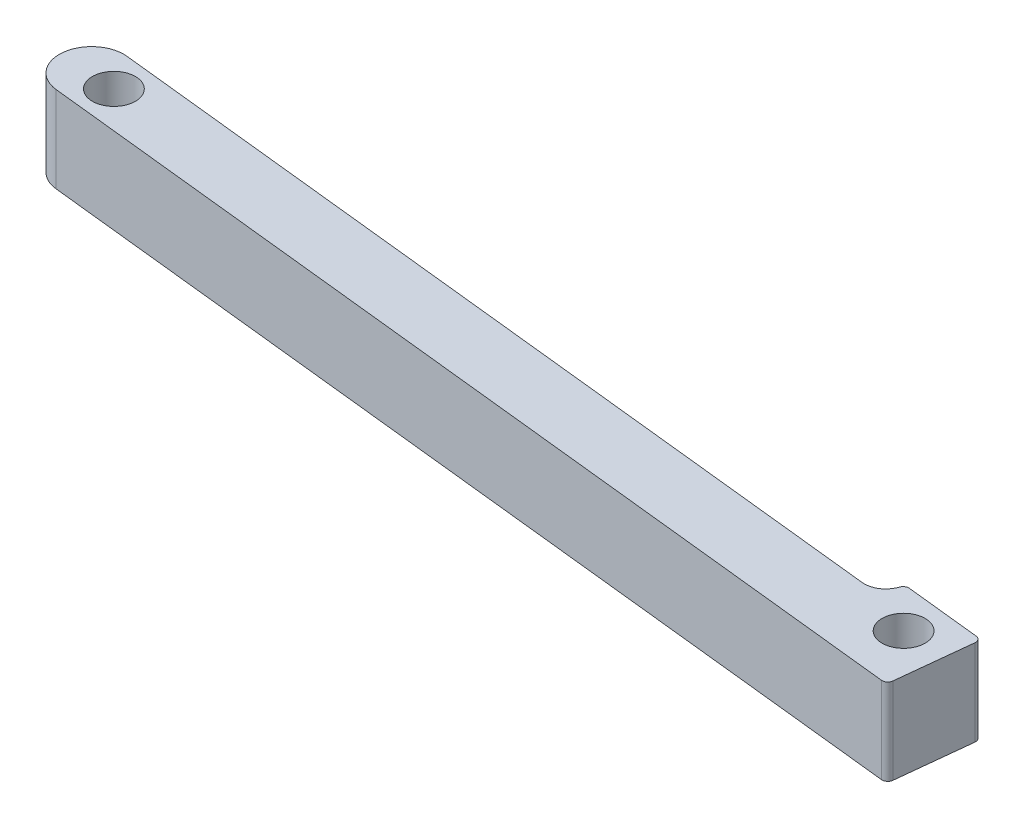
ISO-10303-21;
HEADER;
FILE_DESCRIPTION(('STEP AP214'),'2;1');
FILE_NAME('part.step','',(''),(''),'','','');
FILE_SCHEMA(('AUTOMOTIVE_DESIGN { 1 0 10303 214 1 1 1 1 }'));
ENDSEC;
DATA;
#1=APPLICATION_CONTEXT('core data for automotive mechanical design processes');
#2=APPLICATION_PROTOCOL_DEFINITION('international standard','automotive_design',2000,#1);
#3=PRODUCT_CONTEXT('',#1,'mechanical');
#4=PRODUCT('Part','Part','',(#3));
#5=PRODUCT_RELATED_PRODUCT_CATEGORY('part','',(#4));
#6=PRODUCT_DEFINITION_FORMATION('','',#4);
#7=PRODUCT_DEFINITION_CONTEXT('part definition',#1,'design');
#8=PRODUCT_DEFINITION('design','',#6,#7);
#9=PRODUCT_DEFINITION_SHAPE('','',#8);
#10=(LENGTH_UNIT() NAMED_UNIT(*) SI_UNIT(.MILLI.,.METRE.));
#11=(NAMED_UNIT(*) PLANE_ANGLE_UNIT() SI_UNIT($,.RADIAN.));
#12=(NAMED_UNIT(*) SI_UNIT($,.STERADIAN.) SOLID_ANGLE_UNIT());
#13=UNCERTAINTY_MEASURE_WITH_UNIT(LENGTH_MEASURE(1.E-05),#10,'distance_accuracy_value','');
#14=(GEOMETRIC_REPRESENTATION_CONTEXT(3) GLOBAL_UNCERTAINTY_ASSIGNED_CONTEXT((#13)) GLOBAL_UNIT_ASSIGNED_CONTEXT((#10,
#11,#12)) REPRESENTATION_CONTEXT('',''));
#15=CARTESIAN_POINT('',(0.,0.,0.));
#16=DIRECTION('',(0.,0.,1.));
#17=DIRECTION('',(1.,0.,0.));
#18=AXIS2_PLACEMENT_3D('',#15,#16,#17);
#19=CARTESIAN_POINT('',(161.42092567785,19.05,66.642458073349));
#20=DIRECTION('',(0.106429967465671,0.,-0.994320200954027));
#21=DIRECTION('',(-0.994320200954027,0.,-0.106429967465671));
#22=AXIS2_PLACEMENT_3D('',#19,#20,#21);
#23=PLANE('',#22);
#24=DIRECTION('',(0.994320200954027,0.,0.106429967465671));
#25=VECTOR('',#24,1.);
#26=CARTESIAN_POINT('',(161.42092567785,0.,66.642458073349));
#27=LINE('',#26,#25);
#28=CARTESIAN_POINT('',(-44.3999120852,0.,44.6118234288342));
#29=VERTEX_POINT('',#28);
#30=CARTESIAN_POINT('',(160.158139022639,0.,66.5072920146676));
#31=VERTEX_POINT('',#30);
#32=EDGE_CURVE('E190',#29,#31,#27,.T.);
#33=ORIENTED_EDGE('',*,*,#32,.T.);
#34=DIRECTION('',(0.,-1.,0.));
#35=VECTOR('',#34,1.);
#36=CARTESIAN_POINT('',(160.158139022639,19.05,66.5072920146676));
#37=LINE('',#36,#35);
#38=CARTESIAN_POINT('',(160.158139022639,19.05,66.5072920146676));
#39=VERTEX_POINT('',#38);
#40=EDGE_CURVE('E164',#31,#39,#37,.F.);
#41=ORIENTED_EDGE('',*,*,#40,.T.);
#42=DIRECTION('',(0.994320200954027,0.,0.106429967465671));
#43=VECTOR('',#42,1.);
#44=CARTESIAN_POINT('',(161.42092567785,19.05,66.642458073349));
#45=LINE('',#44,#43);
#46=CARTESIAN_POINT('',(-44.3999120852,19.05,44.6118234288342));
#47=VERTEX_POINT('',#46);
#48=EDGE_CURVE('E187',#47,#39,#45,.T.);
#49=ORIENTED_EDGE('',*,*,#48,.F.);
#50=DIRECTION('',(0.,-1.,0.));
#51=VECTOR('',#50,1.);
#52=CARTESIAN_POINT('',(-44.3999120852,19.05,44.6118234288342));
#53=LINE('',#52,#51);
#54=EDGE_CURVE('E139',#47,#29,#53,.T.);
#55=ORIENTED_EDGE('',*,*,#54,.T.);
#56=EDGE_LOOP('',(#33,#41,#49,#55));
#57=FACE_BOUND('',#56,.T.);
#58=ADVANCED_FACE('F33',(#57),#23,.F.);
#59=CARTESIAN_POINT('',(163.448416558071,19.05,47.7006582451747));
#60=DIRECTION('',(-0.994320200954026,0.,-0.106429967465674));
#61=DIRECTION('',(-0.106429967465674,0.,0.994320200954027));
#62=AXIS2_PLACEMENT_3D('',#59,#60,#61);
#63=PLANE('',#62);
#64=DIRECTION('',(0.106429967465674,0.,-0.994320200954027));
#65=VECTOR('',#64,1.);
#66=CARTESIAN_POINT('',(163.448416558071,19.05,47.7006582451747));
#67=LINE('',#66,#65);
#68=CARTESIAN_POINT('',(161.556091736532,19.05,65.3796714181374));
#69=VERTEX_POINT('',#68);
#70=CARTESIAN_POINT('',(163.31325049939,19.05,48.9634449003863));
#71=VERTEX_POINT('',#70);
#72=EDGE_CURVE('E132',#69,#71,#67,.T.);
#73=ORIENTED_EDGE('',*,*,#72,.F.);
#74=DIRECTION('',(0.,-1.,0.));
#75=VECTOR('',#74,1.);
#76=CARTESIAN_POINT('',(161.556091736532,19.05,65.3796714181374));
#77=LINE('',#76,#75);
#78=CARTESIAN_POINT('',(161.556091736532,0.,65.3796714181374));
#79=VERTEX_POINT('',#78);
#80=EDGE_CURVE('E155',#69,#79,#77,.T.);
#81=ORIENTED_EDGE('',*,*,#80,.T.);
#82=DIRECTION('',(0.106429967465674,0.,-0.994320200954027));
#83=VECTOR('',#82,1.);
#84=CARTESIAN_POINT('',(163.448416558071,0.,47.7006582451747));
#85=LINE('',#84,#83);
#86=CARTESIAN_POINT('',(163.31325049939,0.,48.9634449003863));
#87=VERTEX_POINT('',#86);
#88=EDGE_CURVE('E188',#79,#87,#85,.T.);
#89=ORIENTED_EDGE('',*,*,#88,.T.);
#90=DIRECTION('',(0.,-1.,0.));
#91=VECTOR('',#90,1.);
#92=CARTESIAN_POINT('',(163.31325049939,19.05,48.9634449003863));
#93=LINE('',#92,#91);
#94=EDGE_CURVE('E151',#87,#71,#93,.F.);
#95=ORIENTED_EDGE('',*,*,#94,.T.);
#96=EDGE_LOOP('',(#73,#81,#89,#95));
#97=FACE_BOUND('',#96,.T.);
#98=ADVANCED_FACE('F227',(#97),#63,.F.);
#99=CARTESIAN_POINT('',(-49.4755961405443,19.05,24.9097145205771));
#100=DIRECTION('',(-0.106429967465671,0.,0.994320200954027));
#101=DIRECTION('',(0.994320200954027,0.,0.106429967465671));
#102=AXIS2_PLACEMENT_3D('',#99,#100,#101);
#103=PLANE('',#102);
#104=DIRECTION('',(-0.994320200954027,0.,-0.106429967465671));
#105=VECTOR('',#104,1.);
#106=CARTESIAN_POINT('',(-49.4755961405443,19.05,24.9097145205771));
#107=LINE('',#106,#105);
#108=CARTESIAN_POINT('',(162.18562990286,19.05,47.5654921864933));
#109=VERTEX_POINT('',#108);
#110=CARTESIAN_POINT('',(145.634972049295,19.05,45.7939441728854));
#111=VERTEX_POINT('',#110);
#112=EDGE_CURVE('E130',#109,#111,#107,.T.);
#113=ORIENTED_EDGE('',*,*,#112,.F.);
#114=DIRECTION('',(0.,-1.,0.));
#115=VECTOR('',#114,1.);
#116=CARTESIAN_POINT('',(162.18562990286,19.05,47.5654921864933));
#117=LINE('',#116,#115);
#118=CARTESIAN_POINT('',(162.18562990286,0.,47.5654921864933));
#119=VERTEX_POINT('',#118);
#120=EDGE_CURVE('E41',#109,#119,#117,.T.);
#121=ORIENTED_EDGE('',*,*,#120,.T.);
#122=DIRECTION('',(-0.994320200954027,0.,-0.106429967465671));
#123=VECTOR('',#122,1.);
#124=CARTESIAN_POINT('',(-49.4755961405443,0.,24.9097145205771));
#125=LINE('',#124,#123);
#126=CARTESIAN_POINT('',(145.634972049295,0.,45.7939441728854));
#127=VERTEX_POINT('',#126);
#128=EDGE_CURVE('E135',#119,#127,#125,.T.);
#129=ORIENTED_EDGE('',*,*,#128,.T.);
#130=DIRECTION('',(0.,-1.,0.));
#131=VECTOR('',#130,1.);
#132=CARTESIAN_POINT('',(145.634972049295,19.05,45.7939441728854));
#133=LINE('',#132,#131);
#134=EDGE_CURVE('E171',#127,#111,#133,.F.);
#135=ORIENTED_EDGE('',*,*,#134,.T.);
#136=EDGE_LOOP('',(#113,#121,#129,#135));
#137=FACE_BOUND('',#136,.T.);
#138=ADVANCED_FACE('F178',(#137),#103,.F.);
#139=CARTESIAN_POINT('',(0.,19.05,0.));
#140=DIRECTION('',(0.,-1.,0.));
#141=DIRECTION('',(0.,0.,-1.));
#142=AXIS2_PLACEMENT_3D('',#139,#140,#141);
#143=PLANE('',#142);
#144=CARTESIAN_POINT('',(153.132728777225,19.05,54.5793294001368));
#145=DIRECTION('',(0.,1.,0.));
#146=DIRECTION('',(0.,0.,1.));
#147=AXIS2_PLACEMENT_3D('',#144,#145,#146);
#148=CIRCLE('',#147,4.76250000000001);
#149=CARTESIAN_POINT('',(153.132728777225,19.05,59.3418294001368));
#150=VERTEX_POINT('',#149);
#151=EDGE_CURVE('E205',#150,#150,#148,.T.);
#152=ORIENTED_EDGE('',*,*,#151,.F.);
#153=EDGE_LOOP('',(#152));
#154=FACE_BOUND('',#153,.T.);
#155=CARTESIAN_POINT('',(-38.1149113885663,19.05,38.1));
#156=DIRECTION('',(0.,1.,0.));
#157=DIRECTION('',(0.,0.,1.));
#158=AXIS2_PLACEMENT_3D('',#155,#156,#157);
#159=CIRCLE('',#158,4.7625);
#160=CARTESIAN_POINT('',(-38.1149113885663,19.05,42.8625));
#161=VERTEX_POINT('',#160);
#162=EDGE_CURVE('E199',#161,#161,#159,.T.);
#163=ORIENTED_EDGE('',*,*,#162,.F.);
#164=EDGE_LOOP('',(#163));
#165=FACE_BOUND('',#164,.T.);
#166=ORIENTED_EDGE('',*,*,#48,.T.);
#167=CARTESIAN_POINT('',(160.29330508132,19.05,65.244505359456));
#168=DIRECTION('',(0.,-1.,0.));
#169=DIRECTION('',(0.,0.,-1.));
#170=AXIS2_PLACEMENT_3D('',#167,#168,#169);
#171=CIRCLE('',#170,1.27);
#172=EDGE_CURVE('E169',#39,#69,#171,.F.);
#173=ORIENTED_EDGE('',*,*,#172,.T.);
#174=ORIENTED_EDGE('',*,*,#72,.T.);
#175=CARTESIAN_POINT('',(162.050463844178,19.05,48.8282788417049));
#176=DIRECTION('',(0.,-1.,0.));
#177=DIRECTION('',(0.,0.,-1.));
#178=AXIS2_PLACEMENT_3D('',#175,#176,#177);
#179=CIRCLE('',#178,1.27);
#180=EDGE_CURVE('E167',#71,#109,#179,.F.);
#181=ORIENTED_EDGE('',*,*,#180,.T.);
#182=ORIENTED_EDGE('',*,*,#112,.T.);
#183=CARTESIAN_POINT('',(145.499805990613,19.05,47.056730828097));
#184=DIRECTION('',(0.,-1.,0.));
#185=DIRECTION('',(0.,0.,-1.));
#186=AXIS2_PLACEMENT_3D('',#183,#184,#185);
#187=CIRCLE('',#186,1.27);
#188=CARTESIAN_POINT('',(144.293776681611,19.05,46.6587442632132));
#189=VERTEX_POINT('',#188);
#190=EDGE_CURVE('E48',#111,#189,#187,.F.);
#191=ORIENTED_EDGE('',*,*,#190,.T.);
#192=CARTESIAN_POINT('',(139.771166772854,19.05,45.1662946448988));
#193=DIRECTION('',(0.,-1.,0.));
#194=DIRECTION('',(0.,0.,-1.));
#195=AXIS2_PLACEMENT_3D('',#192,#193,#194);
#196=CIRCLE('',#195,4.7625);
#197=CARTESIAN_POINT('',(139.264294052798,19.05,49.9017446019424));
#198=VERTEX_POINT('',#197);
#199=EDGE_CURVE('E107',#189,#198,#196,.T.);
#200=ORIENTED_EDGE('',*,*,#199,.T.);
#201=DIRECTION('',(0.994320200954026,0.,0.106429967465673));
#202=VECTOR('',#201,1.);
#203=CARTESIAN_POINT('',(-49.9824688605996,19.05,29.6451644776207));
#204=LINE('',#203,#202);
#205=CARTESIAN_POINT('',(-42.8792939250342,19.05,30.4054735577036));
#206=VERTEX_POINT('',#205);
#207=EDGE_CURVE('E111',#206,#198,#204,.T.);
#208=ORIENTED_EDGE('',*,*,#207,.F.);
#209=CARTESIAN_POINT('',(-43.6396030051171,19.05,37.5086484932689));
#210=DIRECTION('',(0.,-1.,0.));
#211=DIRECTION('',(0.,0.,-1.));
#212=AXIS2_PLACEMENT_3D('',#209,#210,#211);
#213=CIRCLE('',#212,7.14375);
#214=CARTESIAN_POINT('',(-50.7427779406824,19.05,36.748339413186));
#215=VERTEX_POINT('',#214);
#216=EDGE_CURVE('E146',#206,#215,#213,.F.);
#217=ORIENTED_EDGE('',*,*,#216,.T.);
#218=CARTESIAN_POINT('',(-43.6396030051171,19.05,37.5086484932689));
#219=DIRECTION('',(0.,-1.,0.));
#220=DIRECTION('',(0.,0.,-1.));
#221=AXIS2_PLACEMENT_3D('',#218,#219,#220);
#222=CIRCLE('',#221,7.14375);
#223=EDGE_CURVE('E148',#215,#47,#222,.F.);
#224=ORIENTED_EDGE('',*,*,#223,.T.);
#225=EDGE_LOOP('',(#166,#173,#174,#181,#182,#191,#200,#208,#217,#224));
#226=FACE_BOUND('',#225,.T.);
#227=ADVANCED_FACE('F110',(#154,#165,#226),#143,.F.);
#228=CARTESIAN_POINT('',(0.,0.,0.));
#229=DIRECTION('',(0.,-1.,0.));
#230=DIRECTION('',(0.,0.,-1.));
#231=AXIS2_PLACEMENT_3D('',#228,#229,#230);
#232=PLANE('',#231);
#233=ORIENTED_EDGE('',*,*,#88,.F.);
#234=CARTESIAN_POINT('',(160.29330508132,0.,65.244505359456));
#235=DIRECTION('',(0.,-1.,0.));
#236=DIRECTION('',(0.,0.,-1.));
#237=AXIS2_PLACEMENT_3D('',#234,#235,#236);
#238=CIRCLE('',#237,1.27);
#239=EDGE_CURVE('E162',#79,#31,#238,.T.);
#240=ORIENTED_EDGE('',*,*,#239,.T.);
#241=ORIENTED_EDGE('',*,*,#32,.F.);
#242=CARTESIAN_POINT('',(-43.6396030051171,0.,37.5086484932689));
#243=DIRECTION('',(0.,-1.,0.));
#244=DIRECTION('',(0.,0.,-1.));
#245=AXIS2_PLACEMENT_3D('',#242,#243,#244);
#246=CIRCLE('',#245,7.14375);
#247=CARTESIAN_POINT('',(-50.7427779406824,0.,36.748339413186));
#248=VERTEX_POINT('',#247);
#249=EDGE_CURVE('E144',#29,#248,#246,.T.);
#250=ORIENTED_EDGE('',*,*,#249,.T.);
#251=CARTESIAN_POINT('',(-43.6396030051171,0.,37.5086484932689));
#252=DIRECTION('',(0.,-1.,0.));
#253=DIRECTION('',(0.,0.,-1.));
#254=AXIS2_PLACEMENT_3D('',#251,#252,#253);
#255=CIRCLE('',#254,7.14375);
#256=CARTESIAN_POINT('',(-42.8792939250342,0.,30.4054735577036));
#257=VERTEX_POINT('',#256);
#258=EDGE_CURVE('E142',#248,#257,#255,.T.);
#259=ORIENTED_EDGE('',*,*,#258,.T.);
#260=DIRECTION('',(0.994320200954026,0.,0.106429967465673));
#261=VECTOR('',#260,1.);
#262=CARTESIAN_POINT('',(-49.9824688605996,0.,29.6451644776207));
#263=LINE('',#262,#261);
#264=CARTESIAN_POINT('',(139.264294052798,0.,49.9017446019424));
#265=VERTEX_POINT('',#264);
#266=EDGE_CURVE('E125',#257,#265,#263,.T.);
#267=ORIENTED_EDGE('',*,*,#266,.T.);
#268=CARTESIAN_POINT('',(139.771166772854,0.,45.1662946448988));
#269=DIRECTION('',(0.,-1.,0.));
#270=DIRECTION('',(0.,0.,-1.));
#271=AXIS2_PLACEMENT_3D('',#268,#269,#270);
#272=CIRCLE('',#271,4.7625);
#273=CARTESIAN_POINT('',(144.293776681611,0.,46.6587442632132));
#274=VERTEX_POINT('',#273);
#275=EDGE_CURVE('E115',#265,#274,#272,.F.);
#276=ORIENTED_EDGE('',*,*,#275,.T.);
#277=CARTESIAN_POINT('',(145.499805990613,0.,47.056730828097));
#278=DIRECTION('',(0.,-1.,0.));
#279=DIRECTION('',(0.,0.,-1.));
#280=AXIS2_PLACEMENT_3D('',#277,#278,#279);
#281=CIRCLE('',#280,1.27);
#282=EDGE_CURVE('E158',#274,#127,#281,.T.);
#283=ORIENTED_EDGE('',*,*,#282,.T.);
#284=ORIENTED_EDGE('',*,*,#128,.F.);
#285=CARTESIAN_POINT('',(162.050463844178,0.,48.8282788417049));
#286=DIRECTION('',(0.,-1.,0.));
#287=DIRECTION('',(0.,0.,-1.));
#288=AXIS2_PLACEMENT_3D('',#285,#286,#287);
#289=CIRCLE('',#288,1.27);
#290=EDGE_CURVE('E160',#119,#87,#289,.T.);
#291=ORIENTED_EDGE('',*,*,#290,.T.);
#292=EDGE_LOOP('',(#233,#240,#241,#250,#259,#267,#276,#283,#284,#291));
#293=FACE_BOUND('',#292,.T.);
#294=CARTESIAN_POINT('',(153.132728777225,0.,54.5793294001368));
#295=DIRECTION('',(0.,1.,0.));
#296=DIRECTION('',(0.,0.,1.));
#297=AXIS2_PLACEMENT_3D('',#294,#295,#296);
#298=CIRCLE('',#297,4.76250000000001);
#299=CARTESIAN_POINT('',(153.132728777225,0.,59.3418294001368));
#300=VERTEX_POINT('',#299);
#301=EDGE_CURVE('E202',#300,#300,#298,.T.);
#302=ORIENTED_EDGE('',*,*,#301,.T.);
#303=EDGE_LOOP('',(#302));
#304=FACE_BOUND('',#303,.T.);
#305=CARTESIAN_POINT('',(-38.1149113885663,0.,38.1));
#306=DIRECTION('',(0.,1.,0.));
#307=DIRECTION('',(0.,0.,1.));
#308=AXIS2_PLACEMENT_3D('',#305,#306,#307);
#309=CIRCLE('',#308,4.7625);
#310=CARTESIAN_POINT('',(-38.1149113885663,0.,42.8625));
#311=VERTEX_POINT('',#310);
#312=EDGE_CURVE('E194',#311,#311,#309,.T.);
#313=ORIENTED_EDGE('',*,*,#312,.T.);
#314=EDGE_LOOP('',(#313));
#315=FACE_BOUND('',#314,.T.);
#316=ADVANCED_FACE('F183',(#293,#304,#315),#232,.T.);
#317=CARTESIAN_POINT('',(-38.1149113885663,0.,38.1));
#318=DIRECTION('',(0.,1.,0.));
#319=DIRECTION('',(0.,0.,1.));
#320=AXIS2_PLACEMENT_3D('',#317,#318,#319);
#321=CYLINDRICAL_SURFACE('',#320,4.7625);
#322=CARTESIAN_POINT('',(-38.1149113885663,0.,42.8625));
#323=CARTESIAN_POINT('',(-38.1149113885663,0.1984375,42.8625));
#324=CARTESIAN_POINT('',(-38.1149113885663,0.396875,42.8625));
#325=CARTESIAN_POINT('',(-38.1149113885663,0.79375,42.8625));
#326=CARTESIAN_POINT('',(-38.1149113885663,0.9921875,42.8625));
#327=CARTESIAN_POINT('',(-38.1149113885663,1.3890625,42.8625));
#328=CARTESIAN_POINT('',(-38.1149113885663,1.5875,42.8625));
#329=CARTESIAN_POINT('',(-38.1149113885663,1.984375,42.8625));
#330=CARTESIAN_POINT('',(-38.1149113885663,2.1828125,42.8625));
#331=CARTESIAN_POINT('',(-38.1149113885663,2.5796875,42.8625));
#332=CARTESIAN_POINT('',(-38.1149113885663,2.778125,42.8625));
#333=CARTESIAN_POINT('',(-38.1149113885663,3.175,42.8625));
#334=CARTESIAN_POINT('',(-38.1149113885663,3.3734375,42.8625));
#335=CARTESIAN_POINT('',(-38.1149113885663,3.7703125,42.8625));
#336=CARTESIAN_POINT('',(-38.1149113885663,3.96875,42.8625));
#337=CARTESIAN_POINT('',(-38.1149113885663,4.365625,42.8625));
#338=CARTESIAN_POINT('',(-38.1149113885663,4.5640625,42.8625));
#339=CARTESIAN_POINT('',(-38.1149113885663,4.9609375,42.8625));
#340=CARTESIAN_POINT('',(-38.1149113885663,5.159375,42.8625));
#341=CARTESIAN_POINT('',(-38.1149113885663,5.55625,42.8625));
#342=CARTESIAN_POINT('',(-38.1149113885663,5.7546875,42.8625));
#343=CARTESIAN_POINT('',(-38.1149113885663,6.1515625,42.8625));
#344=CARTESIAN_POINT('',(-38.1149113885663,6.35,42.8625));
#345=CARTESIAN_POINT('',(-38.1149113885663,6.746875,42.8625));
#346=CARTESIAN_POINT('',(-38.1149113885663,6.9453125,42.8625));
#347=CARTESIAN_POINT('',(-38.1149113885663,7.3421875,42.8625));
#348=CARTESIAN_POINT('',(-38.1149113885663,7.540625,42.8625));
#349=CARTESIAN_POINT('',(-38.1149113885663,7.9375,42.8625));
#350=CARTESIAN_POINT('',(-38.1149113885663,8.1359375,42.8625));
#351=CARTESIAN_POINT('',(-38.1149113885663,8.5328125,42.8625));
#352=CARTESIAN_POINT('',(-38.1149113885663,8.73125,42.8625));
#353=CARTESIAN_POINT('',(-38.1149113885663,9.128125,42.8625));
#354=CARTESIAN_POINT('',(-38.1149113885663,9.3265625,42.8625));
#355=CARTESIAN_POINT('',(-38.1149113885663,9.7234375,42.8625));
#356=CARTESIAN_POINT('',(-38.1149113885663,9.921875,42.8625));
#357=CARTESIAN_POINT('',(-38.1149113885663,10.31875,42.8625));
#358=CARTESIAN_POINT('',(-38.1149113885663,10.5171875,42.8625));
#359=CARTESIAN_POINT('',(-38.1149113885663,10.9140625,42.8625));
#360=CARTESIAN_POINT('',(-38.1149113885663,11.1125,42.8625));
#361=CARTESIAN_POINT('',(-38.1149113885663,11.509375,42.8625));
#362=CARTESIAN_POINT('',(-38.1149113885663,11.7078125,42.8625));
#363=CARTESIAN_POINT('',(-38.1149113885663,12.1046875,42.8625));
#364=CARTESIAN_POINT('',(-38.1149113885663,12.303125,42.8625));
#365=CARTESIAN_POINT('',(-38.1149113885663,12.7,42.8625));
#366=CARTESIAN_POINT('',(-38.1149113885663,12.8984375,42.8625));
#367=CARTESIAN_POINT('',(-38.1149113885663,13.2953125,42.8625));
#368=CARTESIAN_POINT('',(-38.1149113885663,13.49375,42.8625));
#369=CARTESIAN_POINT('',(-38.1149113885663,13.890625,42.8625));
#370=CARTESIAN_POINT('',(-38.1149113885663,14.0890625,42.8625));
#371=CARTESIAN_POINT('',(-38.1149113885663,14.4859375,42.8625));
#372=CARTESIAN_POINT('',(-38.1149113885663,14.684375,42.8625));
#373=CARTESIAN_POINT('',(-38.1149113885663,15.08125,42.8625));
#374=CARTESIAN_POINT('',(-38.1149113885663,15.2796875,42.8625));
#375=CARTESIAN_POINT('',(-38.1149113885663,15.6765625,42.8625));
#376=CARTESIAN_POINT('',(-38.1149113885663,15.875,42.8625));
#377=CARTESIAN_POINT('',(-38.1149113885663,16.271875,42.8625));
#378=CARTESIAN_POINT('',(-38.1149113885663,16.4703125,42.8625));
#379=CARTESIAN_POINT('',(-38.1149113885663,16.8671875,42.8625));
#380=CARTESIAN_POINT('',(-38.1149113885663,17.065625,42.8625));
#381=CARTESIAN_POINT('',(-38.1149113885663,17.4625,42.8625));
#382=CARTESIAN_POINT('',(-38.1149113885663,17.6609375,42.8625));
#383=CARTESIAN_POINT('',(-38.1149113885663,18.0578125,42.8625));
#384=CARTESIAN_POINT('',(-38.1149113885663,18.25625,42.8625));
#385=CARTESIAN_POINT('',(-38.1149113885663,18.653125,42.8625));
#386=CARTESIAN_POINT('',(-38.1149113885663,18.8515625,42.8625));
#387=CARTESIAN_POINT('',(-38.1149113885663,19.05,42.8625));
#388=B_SPLINE_CURVE_WITH_KNOTS('',3,(#322,#323,#324,#325,#326,#327,#328,#329,#330,#331,#332,
#333,#334,#335,#336,#337,#338,#339,#340,#341,#342,#343,#344,#345,#346,#347,#348,#349,#350,#351,
#352,#353,#354,#355,#356,#357,#358,#359,#360,#361,#362,#363,#364,#365,#366,#367,#368,#369,#370,
#371,#372,#373,#374,#375,#376,#377,#378,#379,#380,#381,#382,#383,#384,#385,#386,#387),
.UNSPECIFIED.,.F.,.F.,(4,2,2,2,2,2,2,2,2,2,2,2,2,2,2,2,2,2,2,2,2,2,2,2,2,2,2,2,2,2,2,2,4),(0.,
0.5953125,1.190625,1.7859375,2.38125,2.9765625,3.571875,4.1671875,4.7625,5.3578125,5.953125,
6.5484375,7.14375,7.7390625,8.334375,8.9296875,9.525,10.1203125,10.715625,11.3109375,11.90625,
12.5015625,13.096875,13.6921875,14.2875,14.8828125,15.478125,16.0734375,16.66875,17.2640625,
17.859375,18.4546875,19.05),.UNSPECIFIED.);
#389=EDGE_CURVE('BSEAM286',#311,#161,#388,.T.);
#390=ORIENTED_EDGE('',*,*,#312,.F.);
#391=ORIENTED_EDGE('',*,*,#162,.T.);
#392=ORIENTED_EDGE('',*,*,#389,.T.);
#393=ORIENTED_EDGE('',*,*,#389,.F.);
#394=EDGE_LOOP('',(#390,#392,#391,#393));
#395=FACE_BOUND('',#394,.T.);
#396=ADVANCED_FACE('F286',(#395),#321,.F.);
#397=CARTESIAN_POINT('',(153.132728777225,0.,54.5793294001368));
#398=DIRECTION('',(0.,1.,0.));
#399=DIRECTION('',(0.,0.,1.));
#400=AXIS2_PLACEMENT_3D('',#397,#398,#399);
#401=CYLINDRICAL_SURFACE('',#400,4.76250000000001);
#402=CARTESIAN_POINT('',(153.132728777225,0.,59.3418294001368));
#403=CARTESIAN_POINT('',(153.132728777225,0.1984375,59.3418294001368));
#404=CARTESIAN_POINT('',(153.132728777225,0.396875,59.3418294001368));
#405=CARTESIAN_POINT('',(153.132728777225,0.79375,59.3418294001368));
#406=CARTESIAN_POINT('',(153.132728777225,0.9921875,59.3418294001368));
#407=CARTESIAN_POINT('',(153.132728777225,1.3890625,59.3418294001368));
#408=CARTESIAN_POINT('',(153.132728777225,1.5875,59.3418294001368));
#409=CARTESIAN_POINT('',(153.132728777225,1.984375,59.3418294001368));
#410=CARTESIAN_POINT('',(153.132728777225,2.1828125,59.3418294001368));
#411=CARTESIAN_POINT('',(153.132728777225,2.5796875,59.3418294001368));
#412=CARTESIAN_POINT('',(153.132728777225,2.778125,59.3418294001368));
#413=CARTESIAN_POINT('',(153.132728777225,3.175,59.3418294001368));
#414=CARTESIAN_POINT('',(153.132728777225,3.3734375,59.3418294001368));
#415=CARTESIAN_POINT('',(153.132728777225,3.7703125,59.3418294001368));
#416=CARTESIAN_POINT('',(153.132728777225,3.96875,59.3418294001368));
#417=CARTESIAN_POINT('',(153.132728777225,4.365625,59.3418294001368));
#418=CARTESIAN_POINT('',(153.132728777225,4.5640625,59.3418294001368));
#419=CARTESIAN_POINT('',(153.132728777225,4.9609375,59.3418294001368));
#420=CARTESIAN_POINT('',(153.132728777225,5.159375,59.3418294001368));
#421=CARTESIAN_POINT('',(153.132728777225,5.55625,59.3418294001368));
#422=CARTESIAN_POINT('',(153.132728777225,5.7546875,59.3418294001368));
#423=CARTESIAN_POINT('',(153.132728777225,6.1515625,59.3418294001368));
#424=CARTESIAN_POINT('',(153.132728777225,6.35,59.3418294001368));
#425=CARTESIAN_POINT('',(153.132728777225,6.746875,59.3418294001368));
#426=CARTESIAN_POINT('',(153.132728777225,6.9453125,59.3418294001368));
#427=CARTESIAN_POINT('',(153.132728777225,7.3421875,59.3418294001368));
#428=CARTESIAN_POINT('',(153.132728777225,7.540625,59.3418294001368));
#429=CARTESIAN_POINT('',(153.132728777225,7.9375,59.3418294001368));
#430=CARTESIAN_POINT('',(153.132728777225,8.1359375,59.3418294001368));
#431=CARTESIAN_POINT('',(153.132728777225,8.5328125,59.3418294001368));
#432=CARTESIAN_POINT('',(153.132728777225,8.73125,59.3418294001368));
#433=CARTESIAN_POINT('',(153.132728777225,9.128125,59.3418294001368));
#434=CARTESIAN_POINT('',(153.132728777225,9.3265625,59.3418294001368));
#435=CARTESIAN_POINT('',(153.132728777225,9.7234375,59.3418294001368));
#436=CARTESIAN_POINT('',(153.132728777225,9.921875,59.3418294001368));
#437=CARTESIAN_POINT('',(153.132728777225,10.31875,59.3418294001368));
#438=CARTESIAN_POINT('',(153.132728777225,10.5171875,59.3418294001368));
#439=CARTESIAN_POINT('',(153.132728777225,10.9140625,59.3418294001368));
#440=CARTESIAN_POINT('',(153.132728777225,11.1125,59.3418294001368));
#441=CARTESIAN_POINT('',(153.132728777225,11.509375,59.3418294001368));
#442=CARTESIAN_POINT('',(153.132728777225,11.7078125,59.3418294001368));
#443=CARTESIAN_POINT('',(153.132728777225,12.1046875,59.3418294001368));
#444=CARTESIAN_POINT('',(153.132728777225,12.303125,59.3418294001368));
#445=CARTESIAN_POINT('',(153.132728777225,12.7,59.3418294001368));
#446=CARTESIAN_POINT('',(153.132728777225,12.8984375,59.3418294001368));
#447=CARTESIAN_POINT('',(153.132728777225,13.2953125,59.3418294001368));
#448=CARTESIAN_POINT('',(153.132728777225,13.49375,59.3418294001368));
#449=CARTESIAN_POINT('',(153.132728777225,13.890625,59.3418294001368));
#450=CARTESIAN_POINT('',(153.132728777225,14.0890625,59.3418294001368));
#451=CARTESIAN_POINT('',(153.132728777225,14.4859375,59.3418294001368));
#452=CARTESIAN_POINT('',(153.132728777225,14.684375,59.3418294001368));
#453=CARTESIAN_POINT('',(153.132728777225,15.08125,59.3418294001368));
#454=CARTESIAN_POINT('',(153.132728777225,15.2796875,59.3418294001368));
#455=CARTESIAN_POINT('',(153.132728777225,15.6765625,59.3418294001368));
#456=CARTESIAN_POINT('',(153.132728777225,15.875,59.3418294001368));
#457=CARTESIAN_POINT('',(153.132728777225,16.271875,59.3418294001368));
#458=CARTESIAN_POINT('',(153.132728777225,16.4703125,59.3418294001368));
#459=CARTESIAN_POINT('',(153.132728777225,16.8671875,59.3418294001368));
#460=CARTESIAN_POINT('',(153.132728777225,17.065625,59.3418294001368));
#461=CARTESIAN_POINT('',(153.132728777225,17.4625,59.3418294001368));
#462=CARTESIAN_POINT('',(153.132728777225,17.6609375,59.3418294001368));
#463=CARTESIAN_POINT('',(153.132728777225,18.0578125,59.3418294001368));
#464=CARTESIAN_POINT('',(153.132728777225,18.25625,59.3418294001368));
#465=CARTESIAN_POINT('',(153.132728777225,18.653125,59.3418294001368));
#466=CARTESIAN_POINT('',(153.132728777225,18.8515625,59.3418294001368));
#467=CARTESIAN_POINT('',(153.132728777225,19.05,59.3418294001368));
#468=B_SPLINE_CURVE_WITH_KNOTS('',3,(#402,#403,#404,#405,#406,#407,#408,#409,#410,#411,#412,
#413,#414,#415,#416,#417,#418,#419,#420,#421,#422,#423,#424,#425,#426,#427,#428,#429,#430,#431,
#432,#433,#434,#435,#436,#437,#438,#439,#440,#441,#442,#443,#444,#445,#446,#447,#448,#449,#450,
#451,#452,#453,#454,#455,#456,#457,#458,#459,#460,#461,#462,#463,#464,#465,#466,#467),
.UNSPECIFIED.,.F.,.F.,(4,2,2,2,2,2,2,2,2,2,2,2,2,2,2,2,2,2,2,2,2,2,2,2,2,2,2,2,2,2,2,2,4),(0.,
0.5953125,1.190625,1.7859375,2.38125,2.9765625,3.571875,4.1671875,4.7625,5.3578125,5.953125,
6.5484375,7.14375,7.7390625,8.334375,8.9296875,9.525,10.1203125,10.715625,11.3109375,11.90625,
12.5015625,13.096875,13.6921875,14.2875,14.8828125,15.478125,16.0734375,16.66875,17.2640625,
17.859375,18.4546875,19.05),.UNSPECIFIED.);
#469=EDGE_CURVE('BSEAM320',#300,#150,#468,.T.);
#470=ORIENTED_EDGE('',*,*,#301,.F.);
#471=ORIENTED_EDGE('',*,*,#151,.T.);
#472=ORIENTED_EDGE('',*,*,#469,.T.);
#473=ORIENTED_EDGE('',*,*,#469,.F.);
#474=EDGE_LOOP('',(#470,#472,#471,#473));
#475=FACE_BOUND('',#474,.T.);
#476=ADVANCED_FACE('F320',(#475),#401,.F.);
#477=CARTESIAN_POINT('',(-49.9824688605996,0.,29.6451644776207));
#478=DIRECTION('',(-0.106429967465673,0.,0.994320200954027));
#479=DIRECTION('',(0.994320200954027,0.,0.106429967465673));
#480=AXIS2_PLACEMENT_3D('',#477,#478,#479);
#481=PLANE('',#480);
#482=ORIENTED_EDGE('',*,*,#266,.F.);
#483=DIRECTION('',(0.,1.,0.));
#484=VECTOR('',#483,1.);
#485=CARTESIAN_POINT('',(-42.8792939250342,0.,30.4054735577036));
#486=LINE('',#485,#484);
#487=EDGE_CURVE('E124',#257,#206,#486,.T.);
#488=ORIENTED_EDGE('',*,*,#487,.T.);
#489=ORIENTED_EDGE('',*,*,#207,.T.);
#490=DIRECTION('',(0.,1.,0.));
#491=VECTOR('',#490,1.);
#492=CARTESIAN_POINT('',(139.264294052798,0.,49.9017446019424));
#493=LINE('',#492,#491);
#494=EDGE_CURVE('E116',#198,#265,#493,.F.);
#495=ORIENTED_EDGE('',*,*,#494,.T.);
#496=EDGE_LOOP('',(#482,#488,#489,#495));
#497=FACE_BOUND('',#496,.T.);
#498=ADVANCED_FACE('F121',(#497),#481,.F.);
#499=CARTESIAN_POINT('',(139.771166772854,0.,45.1662946448988));
#500=DIRECTION('',(0.,-1.,0.));
#501=DIRECTION('',(0.,0.,-1.));
#502=AXIS2_PLACEMENT_3D('',#499,#500,#501);
#503=CYLINDRICAL_SURFACE('',#502,4.7625);
#504=ORIENTED_EDGE('',*,*,#199,.F.);
#505=DIRECTION('',(0.,-1.,0.));
#506=VECTOR('',#505,1.);
#507=CARTESIAN_POINT('',(144.293776681611,0.,46.6587442632132));
#508=LINE('',#507,#506);
#509=EDGE_CURVE('E11',#189,#274,#508,.T.);
#510=ORIENTED_EDGE('',*,*,#509,.T.);
#511=ORIENTED_EDGE('',*,*,#275,.F.);
#512=ORIENTED_EDGE('',*,*,#494,.F.);
#513=EDGE_LOOP('',(#504,#510,#511,#512));
#514=FACE_BOUND('',#513,.T.);
#515=ADVANCED_FACE('F128',(#514),#503,.F.);
#516=CARTESIAN_POINT('',(-43.6396030051171,0.,37.5086484932689));
#517=DIRECTION('',(0.,1.,0.));
#518=DIRECTION('',(0.,0.,1.));
#519=AXIS2_PLACEMENT_3D('',#516,#517,#518);
#520=CYLINDRICAL_SURFACE('',#519,7.14375);
#521=DIRECTION('',(0.,1.,0.));
#522=VECTOR('',#521,1.);
#523=CARTESIAN_POINT('',(-50.7427779406824,19.05,36.748339413186));
#524=LINE('',#523,#522);
#525=EDGE_CURVE('E126',#215,#248,#524,.F.);
#526=ORIENTED_EDGE('',*,*,#525,.F.);
#527=ORIENTED_EDGE('',*,*,#216,.F.);
#528=ORIENTED_EDGE('',*,*,#487,.F.);
#529=ORIENTED_EDGE('',*,*,#258,.F.);
#530=EDGE_LOOP('',(#526,#527,#528,#529));
#531=FACE_BOUND('',#530,.T.);
#532=ADVANCED_FACE('F213',(#531),#520,.T.);
#533=CARTESIAN_POINT('',(-43.6396030051171,19.05,37.5086484932689));
#534=DIRECTION('',(0.,-1.,0.));
#535=DIRECTION('',(0.,0.,-1.));
#536=AXIS2_PLACEMENT_3D('',#533,#534,#535);
#537=CYLINDRICAL_SURFACE('',#536,7.14375);
#538=ORIENTED_EDGE('',*,*,#223,.F.);
#539=ORIENTED_EDGE('',*,*,#525,.T.);
#540=ORIENTED_EDGE('',*,*,#249,.F.);
#541=ORIENTED_EDGE('',*,*,#54,.F.);
#542=EDGE_LOOP('',(#538,#539,#540,#541));
#543=FACE_BOUND('',#542,.T.);
#544=ADVANCED_FACE('F222',(#543),#537,.T.);
#545=CARTESIAN_POINT('',(160.29330508132,19.05,65.244505359456));
#546=DIRECTION('',(0.,-1.,0.));
#547=DIRECTION('',(0.,0.,-1.));
#548=AXIS2_PLACEMENT_3D('',#545,#546,#547);
#549=CYLINDRICAL_SURFACE('',#548,1.27);
#550=ORIENTED_EDGE('',*,*,#172,.F.);
#551=ORIENTED_EDGE('',*,*,#40,.F.);
#552=ORIENTED_EDGE('',*,*,#239,.F.);
#553=ORIENTED_EDGE('',*,*,#80,.F.);
#554=EDGE_LOOP('',(#550,#551,#552,#553));
#555=FACE_BOUND('',#554,.T.);
#556=ADVANCED_FACE('F224',(#555),#549,.T.);
#557=CARTESIAN_POINT('',(162.050463844178,19.05,48.8282788417049));
#558=DIRECTION('',(0.,-1.,0.));
#559=DIRECTION('',(0.,0.,-1.));
#560=AXIS2_PLACEMENT_3D('',#557,#558,#559);
#561=CYLINDRICAL_SURFACE('',#560,1.27);
#562=ORIENTED_EDGE('',*,*,#180,.F.);
#563=ORIENTED_EDGE('',*,*,#94,.F.);
#564=ORIENTED_EDGE('',*,*,#290,.F.);
#565=ORIENTED_EDGE('',*,*,#120,.F.);
#566=EDGE_LOOP('',(#562,#563,#564,#565));
#567=FACE_BOUND('',#566,.T.);
#568=ADVANCED_FACE('F228',(#567),#561,.T.);
#569=CARTESIAN_POINT('',(145.499805990613,0.,47.056730828097));
#570=DIRECTION('',(0.,-1.,0.));
#571=DIRECTION('',(0.,0.,-1.));
#572=AXIS2_PLACEMENT_3D('',#569,#570,#571);
#573=CYLINDRICAL_SURFACE('',#572,1.27);
#574=ORIENTED_EDGE('',*,*,#282,.F.);
#575=ORIENTED_EDGE('',*,*,#509,.F.);
#576=ORIENTED_EDGE('',*,*,#190,.F.);
#577=ORIENTED_EDGE('',*,*,#134,.F.);
#578=EDGE_LOOP('',(#574,#575,#576,#577));
#579=FACE_BOUND('',#578,.T.);
#580=ADVANCED_FACE('F35',(#579),#573,.T.);
#581=CLOSED_SHELL('',(#58,#98,#138,#227,#316,#396,#476,#498,#515,#532,#544,#556,#568,#580));
#582=MANIFOLD_SOLID_BREP('B2',#581);
#583=ADVANCED_BREP_SHAPE_REPRESENTATION('',(#18,#582),#14);
#584=SHAPE_DEFINITION_REPRESENTATION(#9,#583);
ENDSEC;
END-ISO-10303-21;
